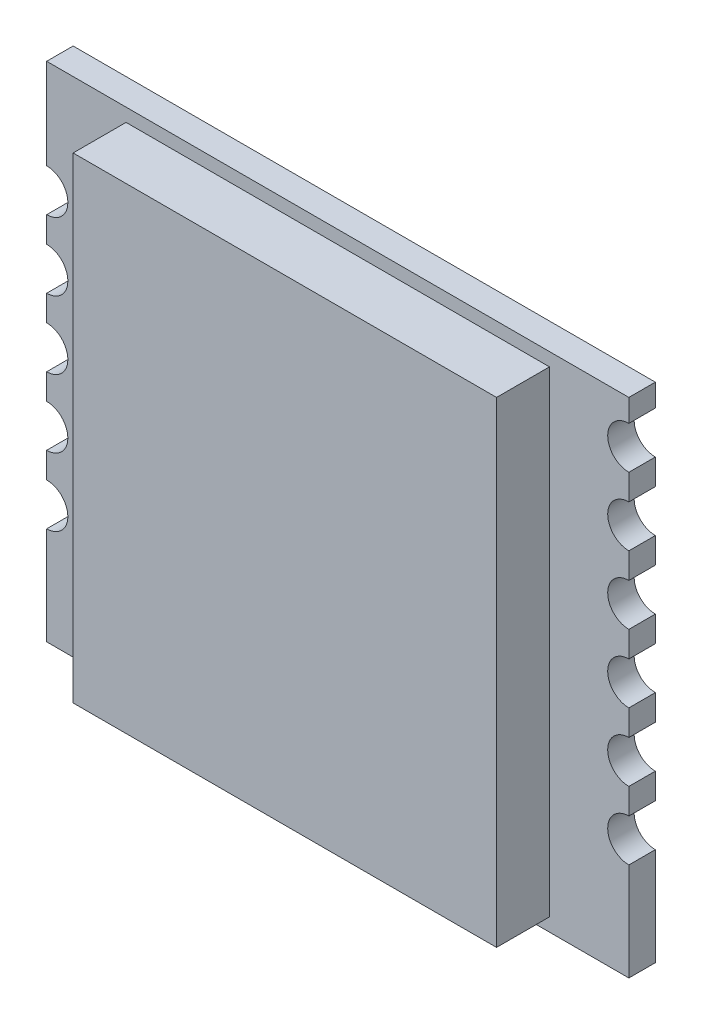
ISO-10303-21;
HEADER;
FILE_DESCRIPTION(('STEP AP214'),'2;1');
FILE_NAME('part.step','',(''),(''),'','','');
FILE_SCHEMA(('AUTOMOTIVE_DESIGN { 1 0 10303 214 1 1 1 1 }'));
ENDSEC;
DATA;
#1=APPLICATION_CONTEXT('core data for automotive mechanical design processes');
#2=APPLICATION_PROTOCOL_DEFINITION('international standard','automotive_design',2000,#1);
#3=PRODUCT_CONTEXT('',#1,'mechanical');
#4=PRODUCT('Part','Part','',(#3));
#5=PRODUCT_RELATED_PRODUCT_CATEGORY('part','',(#4));
#6=PRODUCT_DEFINITION_FORMATION('','',#4);
#7=PRODUCT_DEFINITION_CONTEXT('part definition',#1,'design');
#8=PRODUCT_DEFINITION('design','',#6,#7);
#9=PRODUCT_DEFINITION_SHAPE('','',#8);
#10=(LENGTH_UNIT() NAMED_UNIT(*) SI_UNIT(.MILLI.,.METRE.));
#11=(NAMED_UNIT(*) PLANE_ANGLE_UNIT() SI_UNIT($,.RADIAN.));
#12=(NAMED_UNIT(*) SI_UNIT($,.STERADIAN.) SOLID_ANGLE_UNIT());
#13=UNCERTAINTY_MEASURE_WITH_UNIT(LENGTH_MEASURE(1.E-05),#10,'distance_accuracy_value','');
#14=(GEOMETRIC_REPRESENTATION_CONTEXT(3) GLOBAL_UNCERTAINTY_ASSIGNED_CONTEXT((#13)) GLOBAL_UNIT_ASSIGNED_CONTEXT((#10,
#11,#12)) REPRESENTATION_CONTEXT('',''));
#15=CARTESIAN_POINT('',(0.,0.,0.));
#16=DIRECTION('',(0.,0.,1.));
#17=DIRECTION('',(1.,0.,0.));
#18=AXIS2_PLACEMENT_3D('',#15,#16,#17);
#19=CARTESIAN_POINT('',(0.,0.,3.));
#20=DIRECTION('',(0.,0.,1.));
#21=DIRECTION('',(1.,0.,0.));
#22=AXIS2_PLACEMENT_3D('',#19,#20,#21);
#23=PLANE('',#22);
#24=DIRECTION('',(0.,1.,0.));
#25=VECTOR('',#24,1.);
#26=CARTESIAN_POINT('',(8.,-9.,3.));
#27=LINE('',#26,#25);
#28=CARTESIAN_POINT('',(8.,-9.,3.));
#29=VERTEX_POINT('',#28);
#30=CARTESIAN_POINT('',(8.,9.,3.));
#31=VERTEX_POINT('',#30);
#32=EDGE_CURVE('E226',#29,#31,#27,.T.);
#33=ORIENTED_EDGE('',*,*,#32,.T.);
#34=DIRECTION('',(1.,0.,0.));
#35=VECTOR('',#34,1.);
#36=CARTESIAN_POINT('',(8.,9.,3.));
#37=LINE('',#36,#35);
#38=CARTESIAN_POINT('',(-8.,9.,3.));
#39=VERTEX_POINT('',#38);
#40=EDGE_CURVE('E205',#31,#39,#37,.F.);
#41=ORIENTED_EDGE('',*,*,#40,.T.);
#42=DIRECTION('',(0.,1.,0.));
#43=VECTOR('',#42,1.);
#44=CARTESIAN_POINT('',(-8.,-9.,3.));
#45=LINE('',#44,#43);
#46=CARTESIAN_POINT('',(-8.,-9.,3.));
#47=VERTEX_POINT('',#46);
#48=EDGE_CURVE('E211',#39,#47,#45,.F.);
#49=ORIENTED_EDGE('',*,*,#48,.T.);
#50=DIRECTION('',(-1.,0.,0.));
#51=VECTOR('',#50,1.);
#52=CARTESIAN_POINT('',(8.,-9.,3.));
#53=LINE('',#52,#51);
#54=EDGE_CURVE('E377',#47,#29,#53,.F.);
#55=ORIENTED_EDGE('',*,*,#54,.T.);
#56=EDGE_LOOP('',(#33,#41,#49,#55));
#57=FACE_BOUND('',#56,.T.);
#58=ADVANCED_FACE('F17',(#57),#23,.T.);
#59=CARTESIAN_POINT('',(-8.,-9.,3.));
#60=DIRECTION('',(1.,0.,0.));
#61=DIRECTION('',(0.,0.,-1.));
#62=AXIS2_PLACEMENT_3D('',#59,#60,#61);
#63=PLANE('',#62);
#64=DIRECTION('',(0.,0.,1.));
#65=VECTOR('',#64,1.);
#66=CARTESIAN_POINT('',(-8.,-9.,3.));
#67=LINE('',#66,#65);
#68=CARTESIAN_POINT('',(-8.,-9.,1.));
#69=VERTEX_POINT('',#68);
#70=EDGE_CURVE('E218',#69,#47,#67,.T.);
#71=ORIENTED_EDGE('',*,*,#70,.T.);
#72=ORIENTED_EDGE('',*,*,#48,.F.);
#73=DIRECTION('',(0.,0.,-1.));
#74=VECTOR('',#73,1.);
#75=CARTESIAN_POINT('',(-8.,9.,3.));
#76=LINE('',#75,#74);
#77=CARTESIAN_POINT('',(-8.,9.,1.));
#78=VERTEX_POINT('',#77);
#79=EDGE_CURVE('E215',#39,#78,#76,.T.);
#80=ORIENTED_EDGE('',*,*,#79,.T.);
#81=DIRECTION('',(0.,1.,0.));
#82=VECTOR('',#81,1.);
#83=CARTESIAN_POINT('',(-8.,0.,1.));
#84=LINE('',#83,#82);
#85=EDGE_CURVE('E330',#69,#78,#84,.T.);
#86=ORIENTED_EDGE('',*,*,#85,.F.);
#87=EDGE_LOOP('',(#71,#72,#80,#86));
#88=FACE_BOUND('',#87,.T.);
#89=ADVANCED_FACE('F212',(#88),#63,.F.);
#90=CARTESIAN_POINT('',(8.,9.,3.));
#91=DIRECTION('',(0.,-1.,0.));
#92=DIRECTION('',(0.,0.,-1.));
#93=AXIS2_PLACEMENT_3D('',#90,#91,#92);
#94=PLANE('',#93);
#95=ORIENTED_EDGE('',*,*,#79,.F.);
#96=ORIENTED_EDGE('',*,*,#40,.F.);
#97=DIRECTION('',(0.,0.,1.));
#98=VECTOR('',#97,1.);
#99=CARTESIAN_POINT('',(8.,9.,3.));
#100=LINE('',#99,#98);
#101=CARTESIAN_POINT('',(8.,9.,1.));
#102=VERTEX_POINT('',#101);
#103=EDGE_CURVE('E380',#31,#102,#100,.F.);
#104=ORIENTED_EDGE('',*,*,#103,.T.);
#105=DIRECTION('',(1.,0.,0.));
#106=VECTOR('',#105,1.);
#107=CARTESIAN_POINT('',(0.,9.,1.));
#108=LINE('',#107,#106);
#109=EDGE_CURVE('E225',#78,#102,#108,.T.);
#110=ORIENTED_EDGE('',*,*,#109,.F.);
#111=EDGE_LOOP('',(#95,#96,#104,#110));
#112=FACE_BOUND('',#111,.T.);
#113=ADVANCED_FACE('F223',(#112),#94,.F.);
#114=CARTESIAN_POINT('',(8.,-9.,3.));
#115=DIRECTION('',(-1.,0.,0.));
#116=DIRECTION('',(0.,0.,1.));
#117=AXIS2_PLACEMENT_3D('',#114,#115,#116);
#118=PLANE('',#117);
#119=ORIENTED_EDGE('',*,*,#103,.F.);
#120=ORIENTED_EDGE('',*,*,#32,.F.);
#121=DIRECTION('',(0.,0.,1.));
#122=VECTOR('',#121,1.);
#123=CARTESIAN_POINT('',(8.,-9.,3.));
#124=LINE('',#123,#122);
#125=CARTESIAN_POINT('',(8.,-9.,1.));
#126=VERTEX_POINT('',#125);
#127=EDGE_CURVE('E334',#29,#126,#124,.F.);
#128=ORIENTED_EDGE('',*,*,#127,.T.);
#129=DIRECTION('',(0.,1.,0.));
#130=VECTOR('',#129,1.);
#131=CARTESIAN_POINT('',(8.,0.,1.));
#132=LINE('',#131,#130);
#133=EDGE_CURVE('E317',#102,#126,#132,.F.);
#134=ORIENTED_EDGE('',*,*,#133,.F.);
#135=EDGE_LOOP('',(#119,#120,#128,#134));
#136=FACE_BOUND('',#135,.T.);
#137=ADVANCED_FACE('F385',(#136),#118,.F.);
#138=CARTESIAN_POINT('',(8.,-9.,3.));
#139=DIRECTION('',(0.,1.,0.));
#140=DIRECTION('',(-1.,0.,0.));
#141=AXIS2_PLACEMENT_3D('',#138,#139,#140);
#142=PLANE('',#141);
#143=ORIENTED_EDGE('',*,*,#127,.F.);
#144=ORIENTED_EDGE('',*,*,#54,.F.);
#145=ORIENTED_EDGE('',*,*,#70,.F.);
#146=DIRECTION('',(1.,0.,0.));
#147=VECTOR('',#146,1.);
#148=CARTESIAN_POINT('',(0.,-9.,1.));
#149=LINE('',#148,#147);
#150=EDGE_CURVE('E309',#126,#69,#149,.F.);
#151=ORIENTED_EDGE('',*,*,#150,.F.);
#152=EDGE_LOOP('',(#143,#144,#145,#151));
#153=FACE_BOUND('',#152,.T.);
#154=ADVANCED_FACE('F871',(#153),#142,.F.);
#155=CARTESIAN_POINT('',(0.,0.,1.));
#156=DIRECTION('',(0.,0.,1.));
#157=DIRECTION('',(1.,0.,0.));
#158=AXIS2_PLACEMENT_3D('',#155,#156,#157);
#159=PLANE('',#158);
#160=ORIENTED_EDGE('',*,*,#133,.T.);
#161=ORIENTED_EDGE('',*,*,#150,.T.);
#162=ORIENTED_EDGE('',*,*,#85,.T.);
#163=ORIENTED_EDGE('',*,*,#109,.T.);
#164=EDGE_LOOP('',(#160,#161,#162,#163));
#165=FACE_BOUND('',#164,.T.);
#166=DIRECTION('',(0.,1.,0.));
#167=VECTOR('',#166,1.);
#168=CARTESIAN_POINT('',(-11.,-9.5,1.));
#169=LINE('',#168,#167);
#170=CARTESIAN_POINT('',(-11.,9.5,1.));
#171=VERTEX_POINT('',#170);
#172=CARTESIAN_POINT('',(-11.,6.08,1.));
#173=VERTEX_POINT('',#172);
#174=EDGE_CURVE('E393',#171,#173,#169,.F.);
#175=ORIENTED_EDGE('',*,*,#174,.T.);
#176=CARTESIAN_POINT('',(-11.,5.28,1.));
#177=DIRECTION('',(0.,0.,1.));
#178=DIRECTION('',(1.,0.,0.));
#179=AXIS2_PLACEMENT_3D('',#176,#177,#178);
#180=CIRCLE('',#179,0.8);
#181=CARTESIAN_POINT('',(-11.,4.48,1.));
#182=VERTEX_POINT('',#181);
#183=EDGE_CURVE('E20',#173,#182,#180,.F.);
#184=ORIENTED_EDGE('',*,*,#183,.T.);
#185=DIRECTION('',(0.,1.,0.));
#186=VECTOR('',#185,1.);
#187=CARTESIAN_POINT('',(-11.,0.,1.));
#188=LINE('',#187,#186);
#189=CARTESIAN_POINT('',(-11.,3.51,1.));
#190=VERTEX_POINT('',#189);
#191=EDGE_CURVE('E332',#182,#190,#188,.F.);
#192=ORIENTED_EDGE('',*,*,#191,.T.);
#193=CARTESIAN_POINT('',(-11.,2.71,1.));
#194=DIRECTION('',(0.,0.,1.));
#195=DIRECTION('',(1.,0.,0.));
#196=AXIS2_PLACEMENT_3D('',#193,#194,#195);
#197=CIRCLE('',#196,0.8);
#198=CARTESIAN_POINT('',(-11.,1.91,1.));
#199=VERTEX_POINT('',#198);
#200=EDGE_CURVE('E307',#190,#199,#197,.F.);
#201=ORIENTED_EDGE('',*,*,#200,.T.);
#202=DIRECTION('',(0.,1.,0.));
#203=VECTOR('',#202,1.);
#204=CARTESIAN_POINT('',(-11.,-9.5,1.));
#205=LINE('',#204,#203);
#206=CARTESIAN_POINT('',(-11.,0.94,1.));
#207=VERTEX_POINT('',#206);
#208=EDGE_CURVE('E314',#199,#207,#205,.F.);
#209=ORIENTED_EDGE('',*,*,#208,.T.);
#210=CARTESIAN_POINT('',(-11.,0.14,1.));
#211=DIRECTION('',(0.,0.,1.));
#212=DIRECTION('',(1.,0.,0.));
#213=AXIS2_PLACEMENT_3D('',#210,#211,#212);
#214=CIRCLE('',#213,0.8);
#215=CARTESIAN_POINT('',(-11.,-0.66,1.));
#216=VERTEX_POINT('',#215);
#217=EDGE_CURVE('E304',#207,#216,#214,.F.);
#218=ORIENTED_EDGE('',*,*,#217,.T.);
#219=DIRECTION('',(0.,1.,0.));
#220=VECTOR('',#219,1.);
#221=CARTESIAN_POINT('',(-11.,-9.5,1.));
#222=LINE('',#221,#220);
#223=CARTESIAN_POINT('',(-11.,-1.63,1.));
#224=VERTEX_POINT('',#223);
#225=EDGE_CURVE('E371',#216,#224,#222,.F.);
#226=ORIENTED_EDGE('',*,*,#225,.T.);
#227=CARTESIAN_POINT('',(-11.,-2.43,1.));
#228=DIRECTION('',(0.,0.,1.));
#229=DIRECTION('',(1.,0.,0.));
#230=AXIS2_PLACEMENT_3D('',#227,#228,#229);
#231=CIRCLE('',#230,0.8);
#232=CARTESIAN_POINT('',(-11.,-3.23,1.));
#233=VERTEX_POINT('',#232);
#234=EDGE_CURVE('E300',#224,#233,#231,.F.);
#235=ORIENTED_EDGE('',*,*,#234,.T.);
#236=DIRECTION('',(0.,1.,0.));
#237=VECTOR('',#236,1.);
#238=CARTESIAN_POINT('',(-11.,-9.5,1.));
#239=LINE('',#238,#237);
#240=CARTESIAN_POINT('',(-11.,-4.2,1.));
#241=VERTEX_POINT('',#240);
#242=EDGE_CURVE('E368',#233,#241,#239,.F.);
#243=ORIENTED_EDGE('',*,*,#242,.T.);
#244=CARTESIAN_POINT('',(-11.,-5.,1.));
#245=DIRECTION('',(0.,0.,1.));
#246=DIRECTION('',(1.,0.,0.));
#247=AXIS2_PLACEMENT_3D('',#244,#245,#246);
#248=CIRCLE('',#247,0.8);
#249=CARTESIAN_POINT('',(-11.,-5.8,1.));
#250=VERTEX_POINT('',#249);
#251=EDGE_CURVE('E296',#241,#250,#248,.F.);
#252=ORIENTED_EDGE('',*,*,#251,.T.);
#253=DIRECTION('',(0.,1.,0.));
#254=VECTOR('',#253,1.);
#255=CARTESIAN_POINT('',(-11.,-9.5,1.));
#256=LINE('',#255,#254);
#257=CARTESIAN_POINT('',(-11.,-9.5,1.));
#258=VERTEX_POINT('',#257);
#259=EDGE_CURVE('E364',#250,#258,#256,.F.);
#260=ORIENTED_EDGE('',*,*,#259,.T.);
#261=DIRECTION('',(1.,0.,0.));
#262=VECTOR('',#261,1.);
#263=CARTESIAN_POINT('',(11.,-9.5,1.));
#264=LINE('',#263,#262);
#265=CARTESIAN_POINT('',(11.,-9.5,1.));
#266=VERTEX_POINT('',#265);
#267=EDGE_CURVE('E359',#258,#266,#264,.T.);
#268=ORIENTED_EDGE('',*,*,#267,.T.);
#269=DIRECTION('',(0.,1.,0.));
#270=VECTOR('',#269,1.);
#271=CARTESIAN_POINT('',(11.,-9.5,1.));
#272=LINE('',#271,#270);
#273=CARTESIAN_POINT('',(11.,-5.8,1.));
#274=VERTEX_POINT('',#273);
#275=EDGE_CURVE('E354',#266,#274,#272,.T.);
#276=ORIENTED_EDGE('',*,*,#275,.T.);
#277=CARTESIAN_POINT('',(11.,-5.,1.));
#278=DIRECTION('',(0.,0.,1.));
#279=DIRECTION('',(1.,0.,0.));
#280=AXIS2_PLACEMENT_3D('',#277,#278,#279);
#281=CIRCLE('',#280,0.8);
#282=CARTESIAN_POINT('',(11.,-4.2,1.));
#283=VERTEX_POINT('',#282);
#284=EDGE_CURVE('E292',#274,#283,#281,.F.);
#285=ORIENTED_EDGE('',*,*,#284,.T.);
#286=DIRECTION('',(0.,1.,0.));
#287=VECTOR('',#286,1.);
#288=CARTESIAN_POINT('',(11.,-9.5,1.));
#289=LINE('',#288,#287);
#290=CARTESIAN_POINT('',(11.,-3.23,1.));
#291=VERTEX_POINT('',#290);
#292=EDGE_CURVE('E352',#283,#291,#289,.T.);
#293=ORIENTED_EDGE('',*,*,#292,.T.);
#294=CARTESIAN_POINT('',(11.,-2.43,1.));
#295=DIRECTION('',(0.,0.,1.));
#296=DIRECTION('',(1.,0.,0.));
#297=AXIS2_PLACEMENT_3D('',#294,#295,#296);
#298=CIRCLE('',#297,0.8);
#299=CARTESIAN_POINT('',(11.,-1.63,1.));
#300=VERTEX_POINT('',#299);
#301=EDGE_CURVE('E288',#291,#300,#298,.F.);
#302=ORIENTED_EDGE('',*,*,#301,.T.);
#303=DIRECTION('',(0.,1.,0.));
#304=VECTOR('',#303,1.);
#305=CARTESIAN_POINT('',(11.,-9.5,1.));
#306=LINE('',#305,#304);
#307=CARTESIAN_POINT('',(11.,-0.66,1.));
#308=VERTEX_POINT('',#307);
#309=EDGE_CURVE('E350',#300,#308,#306,.T.);
#310=ORIENTED_EDGE('',*,*,#309,.T.);
#311=CARTESIAN_POINT('',(11.,0.14,1.));
#312=DIRECTION('',(0.,0.,1.));
#313=DIRECTION('',(1.,0.,0.));
#314=AXIS2_PLACEMENT_3D('',#311,#312,#313);
#315=CIRCLE('',#314,0.8);
#316=CARTESIAN_POINT('',(11.,0.94,1.));
#317=VERTEX_POINT('',#316);
#318=EDGE_CURVE('E284',#308,#317,#315,.F.);
#319=ORIENTED_EDGE('',*,*,#318,.T.);
#320=DIRECTION('',(0.,1.,0.));
#321=VECTOR('',#320,1.);
#322=CARTESIAN_POINT('',(11.,-9.5,1.));
#323=LINE('',#322,#321);
#324=CARTESIAN_POINT('',(11.,1.91,1.));
#325=VERTEX_POINT('',#324);
#326=EDGE_CURVE('E348',#317,#325,#323,.T.);
#327=ORIENTED_EDGE('',*,*,#326,.T.);
#328=CARTESIAN_POINT('',(11.,2.71,1.));
#329=DIRECTION('',(0.,0.,1.));
#330=DIRECTION('',(1.,0.,0.));
#331=AXIS2_PLACEMENT_3D('',#328,#329,#330);
#332=CIRCLE('',#331,0.8);
#333=CARTESIAN_POINT('',(11.,3.51,1.));
#334=VERTEX_POINT('',#333);
#335=EDGE_CURVE('E280',#325,#334,#332,.F.);
#336=ORIENTED_EDGE('',*,*,#335,.T.);
#337=DIRECTION('',(0.,1.,0.));
#338=VECTOR('',#337,1.);
#339=CARTESIAN_POINT('',(11.,-9.5,1.));
#340=LINE('',#339,#338);
#341=CARTESIAN_POINT('',(11.,4.48,1.));
#342=VERTEX_POINT('',#341);
#343=EDGE_CURVE('E346',#334,#342,#340,.T.);
#344=ORIENTED_EDGE('',*,*,#343,.T.);
#345=CARTESIAN_POINT('',(11.,5.28,1.));
#346=DIRECTION('',(0.,0.,1.));
#347=DIRECTION('',(1.,0.,0.));
#348=AXIS2_PLACEMENT_3D('',#345,#346,#347);
#349=CIRCLE('',#348,0.8);
#350=CARTESIAN_POINT('',(11.,6.08,1.));
#351=VERTEX_POINT('',#350);
#352=EDGE_CURVE('E276',#342,#351,#349,.F.);
#353=ORIENTED_EDGE('',*,*,#352,.T.);
#354=DIRECTION('',(0.,1.,0.));
#355=VECTOR('',#354,1.);
#356=CARTESIAN_POINT('',(11.,-9.5,1.));
#357=LINE('',#356,#355);
#358=CARTESIAN_POINT('',(11.,7.05,1.));
#359=VERTEX_POINT('',#358);
#360=EDGE_CURVE('E344',#351,#359,#357,.T.);
#361=ORIENTED_EDGE('',*,*,#360,.T.);
#362=CARTESIAN_POINT('',(11.,7.85,1.));
#363=DIRECTION('',(0.,0.,1.));
#364=DIRECTION('',(1.,0.,0.));
#365=AXIS2_PLACEMENT_3D('',#362,#363,#364);
#366=CIRCLE('',#365,0.8);
#367=CARTESIAN_POINT('',(11.,8.65,1.));
#368=VERTEX_POINT('',#367);
#369=EDGE_CURVE('E272',#359,#368,#366,.F.);
#370=ORIENTED_EDGE('',*,*,#369,.T.);
#371=DIRECTION('',(0.,1.,0.));
#372=VECTOR('',#371,1.);
#373=CARTESIAN_POINT('',(11.,-9.5,1.));
#374=LINE('',#373,#372);
#375=CARTESIAN_POINT('',(11.,9.5,1.));
#376=VERTEX_POINT('',#375);
#377=EDGE_CURVE('E340',#368,#376,#374,.T.);
#378=ORIENTED_EDGE('',*,*,#377,.T.);
#379=DIRECTION('',(1.,0.,0.));
#380=VECTOR('',#379,1.);
#381=CARTESIAN_POINT('',(11.,9.5,1.));
#382=LINE('',#381,#380);
#383=EDGE_CURVE('E178',#376,#171,#382,.F.);
#384=ORIENTED_EDGE('',*,*,#383,.T.);
#385=EDGE_LOOP('',(#175,#184,#192,#201,#209,#218,#226,#235,#243,#252,#260,#268,#276,#285,#293,
#302,#310,#319,#327,#336,#344,#353,#361,#370,#378,#384));
#386=FACE_BOUND('',#385,.T.);
#387=ADVANCED_FACE('F387',(#165,#386),#159,.T.);
#388=CARTESIAN_POINT('',(-11.,2.71,0.));
#389=DIRECTION('',(0.,0.,1.));
#390=DIRECTION('',(1.,0.,0.));
#391=AXIS2_PLACEMENT_3D('',#388,#389,#390);
#392=CYLINDRICAL_SURFACE('',#391,0.8);
#393=CARTESIAN_POINT('',(-11.,2.71,0.));
#394=DIRECTION('',(0.,0.,1.));
#395=DIRECTION('',(1.,0.,0.));
#396=AXIS2_PLACEMENT_3D('',#393,#394,#395);
#397=CIRCLE('',#396,0.8);
#398=CARTESIAN_POINT('',(-11.,3.51,0.));
#399=VERTEX_POINT('',#398);
#400=CARTESIAN_POINT('',(-11.,1.91,0.));
#401=VERTEX_POINT('',#400);
#402=EDGE_CURVE('E269',#399,#401,#397,.F.);
#403=ORIENTED_EDGE('',*,*,#402,.T.);
#404=DIRECTION('',(0.,0.,1.));
#405=VECTOR('',#404,1.);
#406=CARTESIAN_POINT('',(-11.,1.91,1.));
#407=LINE('',#406,#405);
#408=EDGE_CURVE('E308',#401,#199,#407,.T.);
#409=ORIENTED_EDGE('',*,*,#408,.T.);
#410=ORIENTED_EDGE('',*,*,#200,.F.);
#411=DIRECTION('',(0.,0.,1.));
#412=VECTOR('',#411,1.);
#413=CARTESIAN_POINT('',(-11.,3.51,1.));
#414=LINE('',#413,#412);
#415=EDGE_CURVE('E398',#190,#399,#414,.F.);
#416=ORIENTED_EDGE('',*,*,#415,.T.);
#417=EDGE_LOOP('',(#403,#409,#410,#416));
#418=FACE_BOUND('',#417,.T.);
#419=ADVANCED_FACE('F853',(#418),#392,.F.);
#420=CARTESIAN_POINT('',(-11.,-9.5,1.));
#421=DIRECTION('',(1.,0.,0.));
#422=DIRECTION('',(0.,1.,0.));
#423=AXIS2_PLACEMENT_3D('',#420,#421,#422);
#424=PLANE('',#423);
#425=ORIENTED_EDGE('',*,*,#408,.F.);
#426=DIRECTION('',(0.,1.,0.));
#427=VECTOR('',#426,1.);
#428=CARTESIAN_POINT('',(-11.,0.,0.));
#429=LINE('',#428,#427);
#430=CARTESIAN_POINT('',(-11.,0.94,0.));
#431=VERTEX_POINT('',#430);
#432=EDGE_CURVE('E268',#401,#431,#429,.F.);
#433=ORIENTED_EDGE('',*,*,#432,.T.);
#434=DIRECTION('',(0.,0.,1.));
#435=VECTOR('',#434,1.);
#436=CARTESIAN_POINT('',(-11.,0.94,0.));
#437=LINE('',#436,#435);
#438=EDGE_CURVE('E306',#431,#207,#437,.T.);
#439=ORIENTED_EDGE('',*,*,#438,.T.);
#440=ORIENTED_EDGE('',*,*,#208,.F.);
#441=EDGE_LOOP('',(#425,#433,#439,#440));
#442=FACE_BOUND('',#441,.T.);
#443=ADVANCED_FACE('F472',(#442),#424,.F.);
#444=CARTESIAN_POINT('',(-11.,0.14,0.));
#445=DIRECTION('',(0.,0.,1.));
#446=DIRECTION('',(1.,0.,0.));
#447=AXIS2_PLACEMENT_3D('',#444,#445,#446);
#448=CYLINDRICAL_SURFACE('',#447,0.8);
#449=CARTESIAN_POINT('',(-11.,0.14,0.));
#450=DIRECTION('',(0.,0.,1.));
#451=DIRECTION('',(1.,0.,0.));
#452=AXIS2_PLACEMENT_3D('',#449,#450,#451);
#453=CIRCLE('',#452,0.8);
#454=CARTESIAN_POINT('',(-11.,-0.66,0.));
#455=VERTEX_POINT('',#454);
#456=EDGE_CURVE('E266',#431,#455,#453,.F.);
#457=ORIENTED_EDGE('',*,*,#456,.T.);
#458=DIRECTION('',(0.,0.,1.));
#459=VECTOR('',#458,1.);
#460=CARTESIAN_POINT('',(-11.,-0.659999999999999,1.));
#461=LINE('',#460,#459);
#462=EDGE_CURVE('E305',#455,#216,#461,.T.);
#463=ORIENTED_EDGE('',*,*,#462,.T.);
#464=ORIENTED_EDGE('',*,*,#217,.F.);
#465=ORIENTED_EDGE('',*,*,#438,.F.);
#466=EDGE_LOOP('',(#457,#463,#464,#465));
#467=FACE_BOUND('',#466,.T.);
#468=ADVANCED_FACE('F476',(#467),#448,.F.);
#469=CARTESIAN_POINT('',(-11.,-9.5,1.));
#470=DIRECTION('',(1.,0.,0.));
#471=DIRECTION('',(0.,1.,0.));
#472=AXIS2_PLACEMENT_3D('',#469,#470,#471);
#473=PLANE('',#472);
#474=ORIENTED_EDGE('',*,*,#462,.F.);
#475=DIRECTION('',(0.,1.,0.));
#476=VECTOR('',#475,1.);
#477=CARTESIAN_POINT('',(-11.,0.,0.));
#478=LINE('',#477,#476);
#479=CARTESIAN_POINT('',(-11.,-1.63,0.));
#480=VERTEX_POINT('',#479);
#481=EDGE_CURVE('E265',#455,#480,#478,.F.);
#482=ORIENTED_EDGE('',*,*,#481,.T.);
#483=DIRECTION('',(0.,0.,1.));
#484=VECTOR('',#483,1.);
#485=CARTESIAN_POINT('',(-11.,-1.63,0.));
#486=LINE('',#485,#484);
#487=EDGE_CURVE('E303',#480,#224,#486,.T.);
#488=ORIENTED_EDGE('',*,*,#487,.T.);
#489=ORIENTED_EDGE('',*,*,#225,.F.);
#490=EDGE_LOOP('',(#474,#482,#488,#489));
#491=FACE_BOUND('',#490,.T.);
#492=ADVANCED_FACE('F591',(#491),#473,.F.);
#493=CARTESIAN_POINT('',(-11.,-2.43,0.));
#494=DIRECTION('',(0.,0.,1.));
#495=DIRECTION('',(1.,0.,0.));
#496=AXIS2_PLACEMENT_3D('',#493,#494,#495);
#497=CYLINDRICAL_SURFACE('',#496,0.8);
#498=CARTESIAN_POINT('',(-11.,-2.43,0.));
#499=DIRECTION('',(0.,0.,1.));
#500=DIRECTION('',(1.,0.,0.));
#501=AXIS2_PLACEMENT_3D('',#498,#499,#500);
#502=CIRCLE('',#501,0.8);
#503=CARTESIAN_POINT('',(-11.,-3.23,0.));
#504=VERTEX_POINT('',#503);
#505=EDGE_CURVE('E263',#480,#504,#502,.F.);
#506=ORIENTED_EDGE('',*,*,#505,.T.);
#507=DIRECTION('',(0.,0.,1.));
#508=VECTOR('',#507,1.);
#509=CARTESIAN_POINT('',(-11.,-3.23,1.));
#510=LINE('',#509,#508);
#511=EDGE_CURVE('E302',#504,#233,#510,.T.);
#512=ORIENTED_EDGE('',*,*,#511,.T.);
#513=ORIENTED_EDGE('',*,*,#234,.F.);
#514=ORIENTED_EDGE('',*,*,#487,.F.);
#515=EDGE_LOOP('',(#506,#512,#513,#514));
#516=FACE_BOUND('',#515,.T.);
#517=ADVANCED_FACE('F589',(#516),#497,.F.);
#518=CARTESIAN_POINT('',(-11.,-9.5,1.));
#519=DIRECTION('',(1.,0.,0.));
#520=DIRECTION('',(0.,1.,0.));
#521=AXIS2_PLACEMENT_3D('',#518,#519,#520);
#522=PLANE('',#521);
#523=ORIENTED_EDGE('',*,*,#511,.F.);
#524=DIRECTION('',(0.,1.,0.));
#525=VECTOR('',#524,1.);
#526=CARTESIAN_POINT('',(-11.,0.,0.));
#527=LINE('',#526,#525);
#528=CARTESIAN_POINT('',(-11.,-4.2,0.));
#529=VERTEX_POINT('',#528);
#530=EDGE_CURVE('E262',#504,#529,#527,.F.);
#531=ORIENTED_EDGE('',*,*,#530,.T.);
#532=DIRECTION('',(0.,0.,1.));
#533=VECTOR('',#532,1.);
#534=CARTESIAN_POINT('',(-11.,-4.2,0.));
#535=LINE('',#534,#533);
#536=EDGE_CURVE('E299',#529,#241,#535,.T.);
#537=ORIENTED_EDGE('',*,*,#536,.T.);
#538=ORIENTED_EDGE('',*,*,#242,.F.);
#539=EDGE_LOOP('',(#523,#531,#537,#538));
#540=FACE_BOUND('',#539,.T.);
#541=ADVANCED_FACE('F586',(#540),#522,.F.);
#542=CARTESIAN_POINT('',(-11.,-5.,0.));
#543=DIRECTION('',(0.,0.,1.));
#544=DIRECTION('',(1.,0.,0.));
#545=AXIS2_PLACEMENT_3D('',#542,#543,#544);
#546=CYLINDRICAL_SURFACE('',#545,0.8);
#547=CARTESIAN_POINT('',(-11.,-5.,0.));
#548=DIRECTION('',(0.,0.,1.));
#549=DIRECTION('',(1.,0.,0.));
#550=AXIS2_PLACEMENT_3D('',#547,#548,#549);
#551=CIRCLE('',#550,0.8);
#552=CARTESIAN_POINT('',(-11.,-5.8,0.));
#553=VERTEX_POINT('',#552);
#554=EDGE_CURVE('E259',#529,#553,#551,.F.);
#555=ORIENTED_EDGE('',*,*,#554,.T.);
#556=DIRECTION('',(0.,0.,1.));
#557=VECTOR('',#556,1.);
#558=CARTESIAN_POINT('',(-11.,-5.8,1.));
#559=LINE('',#558,#557);
#560=EDGE_CURVE('E298',#553,#250,#559,.T.);
#561=ORIENTED_EDGE('',*,*,#560,.T.);
#562=ORIENTED_EDGE('',*,*,#251,.F.);
#563=ORIENTED_EDGE('',*,*,#536,.F.);
#564=EDGE_LOOP('',(#555,#561,#562,#563));
#565=FACE_BOUND('',#564,.T.);
#566=ADVANCED_FACE('F592',(#565),#546,.F.);
#567=CARTESIAN_POINT('',(-11.,-9.5,1.));
#568=DIRECTION('',(1.,0.,0.));
#569=DIRECTION('',(0.,1.,0.));
#570=AXIS2_PLACEMENT_3D('',#567,#568,#569);
#571=PLANE('',#570);
#572=ORIENTED_EDGE('',*,*,#560,.F.);
#573=DIRECTION('',(0.,1.,0.));
#574=VECTOR('',#573,1.);
#575=CARTESIAN_POINT('',(-11.,0.,0.));
#576=LINE('',#575,#574);
#577=CARTESIAN_POINT('',(-11.,-9.5,0.));
#578=VERTEX_POINT('',#577);
#579=EDGE_CURVE('E261',#553,#578,#576,.F.);
#580=ORIENTED_EDGE('',*,*,#579,.T.);
#581=DIRECTION('',(0.,0.,1.));
#582=VECTOR('',#581,1.);
#583=CARTESIAN_POINT('',(-11.,-9.5,1.));
#584=LINE('',#583,#582);
#585=EDGE_CURVE('E361',#578,#258,#584,.T.);
#586=ORIENTED_EDGE('',*,*,#585,.T.);
#587=ORIENTED_EDGE('',*,*,#259,.F.);
#588=EDGE_LOOP('',(#572,#580,#586,#587));
#589=FACE_BOUND('',#588,.T.);
#590=ADVANCED_FACE('F581',(#589),#571,.F.);
#591=CARTESIAN_POINT('',(11.,-9.5,1.));
#592=DIRECTION('',(0.,1.,0.));
#593=DIRECTION('',(0.,0.,1.));
#594=AXIS2_PLACEMENT_3D('',#591,#592,#593);
#595=PLANE('',#594);
#596=DIRECTION('',(0.,0.,1.));
#597=VECTOR('',#596,1.);
#598=CARTESIAN_POINT('',(11.,-9.5,1.));
#599=LINE('',#598,#597);
#600=CARTESIAN_POINT('',(11.,-9.5,0.));
#601=VERTEX_POINT('',#600);
#602=EDGE_CURVE('E356',#601,#266,#599,.T.);
#603=ORIENTED_EDGE('',*,*,#602,.T.);
#604=ORIENTED_EDGE('',*,*,#267,.F.);
#605=ORIENTED_EDGE('',*,*,#585,.F.);
#606=DIRECTION('',(1.,0.,0.));
#607=VECTOR('',#606,1.);
#608=CARTESIAN_POINT('',(0.,-9.5,0.));
#609=LINE('',#608,#607);
#610=EDGE_CURVE('E449',#578,#601,#609,.T.);
#611=ORIENTED_EDGE('',*,*,#610,.T.);
#612=EDGE_LOOP('',(#603,#604,#605,#611));
#613=FACE_BOUND('',#612,.T.);
#614=ADVANCED_FACE('F576',(#613),#595,.F.);
#615=CARTESIAN_POINT('',(11.,-9.5,1.));
#616=DIRECTION('',(-1.,0.,0.));
#617=DIRECTION('',(0.,0.,1.));
#618=AXIS2_PLACEMENT_3D('',#615,#616,#617);
#619=PLANE('',#618);
#620=DIRECTION('',(0.,0.,1.));
#621=VECTOR('',#620,1.);
#622=CARTESIAN_POINT('',(11.,-5.8,0.));
#623=LINE('',#622,#621);
#624=CARTESIAN_POINT('',(11.,-5.8,0.));
#625=VERTEX_POINT('',#624);
#626=EDGE_CURVE('E295',#625,#274,#623,.T.);
#627=ORIENTED_EDGE('',*,*,#626,.T.);
#628=ORIENTED_EDGE('',*,*,#275,.F.);
#629=ORIENTED_EDGE('',*,*,#602,.F.);
#630=DIRECTION('',(0.,1.,0.));
#631=VECTOR('',#630,1.);
#632=CARTESIAN_POINT('',(11.,0.,0.));
#633=LINE('',#632,#631);
#634=EDGE_CURVE('E258',#601,#625,#633,.T.);
#635=ORIENTED_EDGE('',*,*,#634,.T.);
#636=EDGE_LOOP('',(#627,#628,#629,#635));
#637=FACE_BOUND('',#636,.T.);
#638=ADVANCED_FACE('F572',(#637),#619,.F.);
#639=CARTESIAN_POINT('',(11.,-5.,0.));
#640=DIRECTION('',(0.,0.,1.));
#641=DIRECTION('',(1.,0.,0.));
#642=AXIS2_PLACEMENT_3D('',#639,#640,#641);
#643=CYLINDRICAL_SURFACE('',#642,0.8);
#644=ORIENTED_EDGE('',*,*,#626,.F.);
#645=CARTESIAN_POINT('',(11.,-5.,0.));
#646=DIRECTION('',(0.,0.,1.));
#647=DIRECTION('',(1.,0.,0.));
#648=AXIS2_PLACEMENT_3D('',#645,#646,#647);
#649=CIRCLE('',#648,0.8);
#650=CARTESIAN_POINT('',(11.,-4.2,0.));
#651=VERTEX_POINT('',#650);
#652=EDGE_CURVE('E255',#625,#651,#649,.F.);
#653=ORIENTED_EDGE('',*,*,#652,.T.);
#654=DIRECTION('',(0.,0.,1.));
#655=VECTOR('',#654,1.);
#656=CARTESIAN_POINT('',(11.,-4.2,1.));
#657=LINE('',#656,#655);
#658=EDGE_CURVE('E294',#651,#283,#657,.T.);
#659=ORIENTED_EDGE('',*,*,#658,.T.);
#660=ORIENTED_EDGE('',*,*,#284,.F.);
#661=EDGE_LOOP('',(#644,#653,#659,#660));
#662=FACE_BOUND('',#661,.T.);
#663=ADVANCED_FACE('F568',(#662),#643,.F.);
#664=CARTESIAN_POINT('',(11.,-9.5,1.));
#665=DIRECTION('',(-1.,0.,0.));
#666=DIRECTION('',(0.,0.,1.));
#667=AXIS2_PLACEMENT_3D('',#664,#665,#666);
#668=PLANE('',#667);
#669=DIRECTION('',(0.,0.,1.));
#670=VECTOR('',#669,1.);
#671=CARTESIAN_POINT('',(11.,-3.23,0.));
#672=LINE('',#671,#670);
#673=CARTESIAN_POINT('',(11.,-3.23,0.));
#674=VERTEX_POINT('',#673);
#675=EDGE_CURVE('E291',#674,#291,#672,.T.);
#676=ORIENTED_EDGE('',*,*,#675,.T.);
#677=ORIENTED_EDGE('',*,*,#292,.F.);
#678=ORIENTED_EDGE('',*,*,#658,.F.);
#679=DIRECTION('',(0.,1.,0.));
#680=VECTOR('',#679,1.);
#681=CARTESIAN_POINT('',(11.,0.,0.));
#682=LINE('',#681,#680);
#683=EDGE_CURVE('E254',#651,#674,#682,.T.);
#684=ORIENTED_EDGE('',*,*,#683,.T.);
#685=EDGE_LOOP('',(#676,#677,#678,#684));
#686=FACE_BOUND('',#685,.T.);
#687=ADVANCED_FACE('F564',(#686),#668,.F.);
#688=CARTESIAN_POINT('',(11.,-2.43,0.));
#689=DIRECTION('',(0.,0.,1.));
#690=DIRECTION('',(1.,0.,0.));
#691=AXIS2_PLACEMENT_3D('',#688,#689,#690);
#692=CYLINDRICAL_SURFACE('',#691,0.8);
#693=ORIENTED_EDGE('',*,*,#675,.F.);
#694=CARTESIAN_POINT('',(11.,-2.43,0.));
#695=DIRECTION('',(0.,0.,1.));
#696=DIRECTION('',(1.,0.,0.));
#697=AXIS2_PLACEMENT_3D('',#694,#695,#696);
#698=CIRCLE('',#697,0.8);
#699=CARTESIAN_POINT('',(11.,-1.63,0.));
#700=VERTEX_POINT('',#699);
#701=EDGE_CURVE('E251',#674,#700,#698,.F.);
#702=ORIENTED_EDGE('',*,*,#701,.T.);
#703=DIRECTION('',(0.,0.,1.));
#704=VECTOR('',#703,1.);
#705=CARTESIAN_POINT('',(11.,-1.63,1.));
#706=LINE('',#705,#704);
#707=EDGE_CURVE('E290',#700,#300,#706,.T.);
#708=ORIENTED_EDGE('',*,*,#707,.T.);
#709=ORIENTED_EDGE('',*,*,#301,.F.);
#710=EDGE_LOOP('',(#693,#702,#708,#709));
#711=FACE_BOUND('',#710,.T.);
#712=ADVANCED_FACE('F560',(#711),#692,.F.);
#713=CARTESIAN_POINT('',(11.,-9.5,1.));
#714=DIRECTION('',(-1.,0.,0.));
#715=DIRECTION('',(0.,0.,1.));
#716=AXIS2_PLACEMENT_3D('',#713,#714,#715);
#717=PLANE('',#716);
#718=ORIENTED_EDGE('',*,*,#707,.F.);
#719=DIRECTION('',(0.,1.,0.));
#720=VECTOR('',#719,1.);
#721=CARTESIAN_POINT('',(11.,0.,0.));
#722=LINE('',#721,#720);
#723=CARTESIAN_POINT('',(11.,-0.66,0.));
#724=VERTEX_POINT('',#723);
#725=EDGE_CURVE('E250',#700,#724,#722,.T.);
#726=ORIENTED_EDGE('',*,*,#725,.T.);
#727=DIRECTION('',(0.,0.,1.));
#728=VECTOR('',#727,1.);
#729=CARTESIAN_POINT('',(11.,-0.66,0.));
#730=LINE('',#729,#728);
#731=EDGE_CURVE('E287',#724,#308,#730,.T.);
#732=ORIENTED_EDGE('',*,*,#731,.T.);
#733=ORIENTED_EDGE('',*,*,#309,.F.);
#734=EDGE_LOOP('',(#718,#726,#732,#733));
#735=FACE_BOUND('',#734,.T.);
#736=ADVANCED_FACE('F556',(#735),#717,.F.);
#737=CARTESIAN_POINT('',(11.,0.14,0.));
#738=DIRECTION('',(0.,0.,1.));
#739=DIRECTION('',(1.,0.,0.));
#740=AXIS2_PLACEMENT_3D('',#737,#738,#739);
#741=CYLINDRICAL_SURFACE('',#740,0.8);
#742=ORIENTED_EDGE('',*,*,#731,.F.);
#743=CARTESIAN_POINT('',(11.,0.14,0.));
#744=DIRECTION('',(0.,0.,1.));
#745=DIRECTION('',(1.,0.,0.));
#746=AXIS2_PLACEMENT_3D('',#743,#744,#745);
#747=CIRCLE('',#746,0.8);
#748=CARTESIAN_POINT('',(11.,0.94,0.));
#749=VERTEX_POINT('',#748);
#750=EDGE_CURVE('E247',#724,#749,#747,.F.);
#751=ORIENTED_EDGE('',*,*,#750,.T.);
#752=DIRECTION('',(0.,0.,1.));
#753=VECTOR('',#752,1.);
#754=CARTESIAN_POINT('',(11.,0.94,1.));
#755=LINE('',#754,#753);
#756=EDGE_CURVE('E286',#749,#317,#755,.T.);
#757=ORIENTED_EDGE('',*,*,#756,.T.);
#758=ORIENTED_EDGE('',*,*,#318,.F.);
#759=EDGE_LOOP('',(#742,#751,#757,#758));
#760=FACE_BOUND('',#759,.T.);
#761=ADVANCED_FACE('F552',(#760),#741,.F.);
#762=CARTESIAN_POINT('',(11.,-9.5,1.));
#763=DIRECTION('',(-1.,0.,0.));
#764=DIRECTION('',(0.,0.,1.));
#765=AXIS2_PLACEMENT_3D('',#762,#763,#764);
#766=PLANE('',#765);
#767=ORIENTED_EDGE('',*,*,#756,.F.);
#768=DIRECTION('',(0.,1.,0.));
#769=VECTOR('',#768,1.);
#770=CARTESIAN_POINT('',(11.,0.,0.));
#771=LINE('',#770,#769);
#772=CARTESIAN_POINT('',(11.,1.91,0.));
#773=VERTEX_POINT('',#772);
#774=EDGE_CURVE('E246',#749,#773,#771,.T.);
#775=ORIENTED_EDGE('',*,*,#774,.T.);
#776=DIRECTION('',(0.,0.,1.));
#777=VECTOR('',#776,1.);
#778=CARTESIAN_POINT('',(11.,1.91,0.));
#779=LINE('',#778,#777);
#780=EDGE_CURVE('E283',#773,#325,#779,.T.);
#781=ORIENTED_EDGE('',*,*,#780,.T.);
#782=ORIENTED_EDGE('',*,*,#326,.F.);
#783=EDGE_LOOP('',(#767,#775,#781,#782));
#784=FACE_BOUND('',#783,.T.);
#785=ADVANCED_FACE('F548',(#784),#766,.F.);
#786=CARTESIAN_POINT('',(11.,2.71,0.));
#787=DIRECTION('',(0.,0.,1.));
#788=DIRECTION('',(1.,0.,0.));
#789=AXIS2_PLACEMENT_3D('',#786,#787,#788);
#790=CYLINDRICAL_SURFACE('',#789,0.8);
#791=ORIENTED_EDGE('',*,*,#780,.F.);
#792=CARTESIAN_POINT('',(11.,2.71,0.));
#793=DIRECTION('',(0.,0.,1.));
#794=DIRECTION('',(1.,0.,0.));
#795=AXIS2_PLACEMENT_3D('',#792,#793,#794);
#796=CIRCLE('',#795,0.8);
#797=CARTESIAN_POINT('',(11.,3.51,0.));
#798=VERTEX_POINT('',#797);
#799=EDGE_CURVE('E243',#773,#798,#796,.F.);
#800=ORIENTED_EDGE('',*,*,#799,.T.);
#801=DIRECTION('',(0.,0.,1.));
#802=VECTOR('',#801,1.);
#803=CARTESIAN_POINT('',(11.,3.51,1.));
#804=LINE('',#803,#802);
#805=EDGE_CURVE('E282',#798,#334,#804,.T.);
#806=ORIENTED_EDGE('',*,*,#805,.T.);
#807=ORIENTED_EDGE('',*,*,#335,.F.);
#808=EDGE_LOOP('',(#791,#800,#806,#807));
#809=FACE_BOUND('',#808,.T.);
#810=ADVANCED_FACE('F544',(#809),#790,.F.);
#811=CARTESIAN_POINT('',(11.,-9.5,1.));
#812=DIRECTION('',(-1.,0.,0.));
#813=DIRECTION('',(0.,0.,1.));
#814=AXIS2_PLACEMENT_3D('',#811,#812,#813);
#815=PLANE('',#814);
#816=ORIENTED_EDGE('',*,*,#805,.F.);
#817=DIRECTION('',(0.,1.,0.));
#818=VECTOR('',#817,1.);
#819=CARTESIAN_POINT('',(11.,0.,0.));
#820=LINE('',#819,#818);
#821=CARTESIAN_POINT('',(11.,4.48,0.));
#822=VERTEX_POINT('',#821);
#823=EDGE_CURVE('E242',#798,#822,#820,.T.);
#824=ORIENTED_EDGE('',*,*,#823,.T.);
#825=DIRECTION('',(0.,0.,1.));
#826=VECTOR('',#825,1.);
#827=CARTESIAN_POINT('',(11.,4.48,0.));
#828=LINE('',#827,#826);
#829=EDGE_CURVE('E279',#822,#342,#828,.T.);
#830=ORIENTED_EDGE('',*,*,#829,.T.);
#831=ORIENTED_EDGE('',*,*,#343,.F.);
#832=EDGE_LOOP('',(#816,#824,#830,#831));
#833=FACE_BOUND('',#832,.T.);
#834=ADVANCED_FACE('F540',(#833),#815,.F.);
#835=CARTESIAN_POINT('',(11.,5.28,0.));
#836=DIRECTION('',(0.,0.,1.));
#837=DIRECTION('',(1.,0.,0.));
#838=AXIS2_PLACEMENT_3D('',#835,#836,#837);
#839=CYLINDRICAL_SURFACE('',#838,0.8);
#840=ORIENTED_EDGE('',*,*,#829,.F.);
#841=CARTESIAN_POINT('',(11.,5.28,0.));
#842=DIRECTION('',(0.,0.,1.));
#843=DIRECTION('',(1.,0.,0.));
#844=AXIS2_PLACEMENT_3D('',#841,#842,#843);
#845=CIRCLE('',#844,0.8);
#846=CARTESIAN_POINT('',(11.,6.08,0.));
#847=VERTEX_POINT('',#846);
#848=EDGE_CURVE('E239',#822,#847,#845,.F.);
#849=ORIENTED_EDGE('',*,*,#848,.T.);
#850=DIRECTION('',(0.,0.,1.));
#851=VECTOR('',#850,1.);
#852=CARTESIAN_POINT('',(11.,6.08,1.));
#853=LINE('',#852,#851);
#854=EDGE_CURVE('E278',#847,#351,#853,.T.);
#855=ORIENTED_EDGE('',*,*,#854,.T.);
#856=ORIENTED_EDGE('',*,*,#352,.F.);
#857=EDGE_LOOP('',(#840,#849,#855,#856));
#858=FACE_BOUND('',#857,.T.);
#859=ADVANCED_FACE('F536',(#858),#839,.F.);
#860=CARTESIAN_POINT('',(11.,-9.5,1.));
#861=DIRECTION('',(-1.,0.,0.));
#862=DIRECTION('',(0.,0.,1.));
#863=AXIS2_PLACEMENT_3D('',#860,#861,#862);
#864=PLANE('',#863);
#865=ORIENTED_EDGE('',*,*,#854,.F.);
#866=DIRECTION('',(0.,1.,0.));
#867=VECTOR('',#866,1.);
#868=CARTESIAN_POINT('',(11.,0.,0.));
#869=LINE('',#868,#867);
#870=CARTESIAN_POINT('',(11.,7.05,0.));
#871=VERTEX_POINT('',#870);
#872=EDGE_CURVE('E238',#847,#871,#869,.T.);
#873=ORIENTED_EDGE('',*,*,#872,.T.);
#874=DIRECTION('',(0.,0.,1.));
#875=VECTOR('',#874,1.);
#876=CARTESIAN_POINT('',(11.,7.05,0.));
#877=LINE('',#876,#875);
#878=EDGE_CURVE('E275',#871,#359,#877,.T.);
#879=ORIENTED_EDGE('',*,*,#878,.T.);
#880=ORIENTED_EDGE('',*,*,#360,.F.);
#881=EDGE_LOOP('',(#865,#873,#879,#880));
#882=FACE_BOUND('',#881,.T.);
#883=ADVANCED_FACE('F532',(#882),#864,.F.);
#884=CARTESIAN_POINT('',(11.,7.85,0.));
#885=DIRECTION('',(0.,0.,1.));
#886=DIRECTION('',(1.,0.,0.));
#887=AXIS2_PLACEMENT_3D('',#884,#885,#886);
#888=CYLINDRICAL_SURFACE('',#887,0.8);
#889=ORIENTED_EDGE('',*,*,#878,.F.);
#890=CARTESIAN_POINT('',(11.,7.85,0.));
#891=DIRECTION('',(0.,0.,1.));
#892=DIRECTION('',(1.,0.,0.));
#893=AXIS2_PLACEMENT_3D('',#890,#891,#892);
#894=CIRCLE('',#893,0.8);
#895=CARTESIAN_POINT('',(11.,8.65,0.));
#896=VERTEX_POINT('',#895);
#897=EDGE_CURVE('E234',#871,#896,#894,.F.);
#898=ORIENTED_EDGE('',*,*,#897,.T.);
#899=DIRECTION('',(0.,0.,1.));
#900=VECTOR('',#899,1.);
#901=CARTESIAN_POINT('',(11.,8.65,1.));
#902=LINE('',#901,#900);
#903=EDGE_CURVE('E274',#896,#368,#902,.T.);
#904=ORIENTED_EDGE('',*,*,#903,.T.);
#905=ORIENTED_EDGE('',*,*,#369,.F.);
#906=EDGE_LOOP('',(#889,#898,#904,#905));
#907=FACE_BOUND('',#906,.T.);
#908=ADVANCED_FACE('F528',(#907),#888,.F.);
#909=CARTESIAN_POINT('',(11.,-9.5,1.));
#910=DIRECTION('',(-1.,0.,0.));
#911=DIRECTION('',(0.,0.,1.));
#912=AXIS2_PLACEMENT_3D('',#909,#910,#911);
#913=PLANE('',#912);
#914=ORIENTED_EDGE('',*,*,#903,.F.);
#915=DIRECTION('',(0.,1.,0.));
#916=VECTOR('',#915,1.);
#917=CARTESIAN_POINT('',(11.,0.,0.));
#918=LINE('',#917,#916);
#919=CARTESIAN_POINT('',(11.,9.5,0.));
#920=VERTEX_POINT('',#919);
#921=EDGE_CURVE('E237',#896,#920,#918,.T.);
#922=ORIENTED_EDGE('',*,*,#921,.T.);
#923=DIRECTION('',(0.,0.,1.));
#924=VECTOR('',#923,1.);
#925=CARTESIAN_POINT('',(11.,9.5,1.));
#926=LINE('',#925,#924);
#927=EDGE_CURVE('E337',#920,#376,#926,.T.);
#928=ORIENTED_EDGE('',*,*,#927,.T.);
#929=ORIENTED_EDGE('',*,*,#377,.F.);
#930=EDGE_LOOP('',(#914,#922,#928,#929));
#931=FACE_BOUND('',#930,.T.);
#932=ADVANCED_FACE('F524',(#931),#913,.F.);
#933=CARTESIAN_POINT('',(11.,9.5,1.));
#934=DIRECTION('',(0.,-1.,0.));
#935=DIRECTION('',(1.,0.,0.));
#936=AXIS2_PLACEMENT_3D('',#933,#934,#935);
#937=PLANE('',#936);
#938=DIRECTION('',(0.,0.,1.));
#939=VECTOR('',#938,1.);
#940=CARTESIAN_POINT('',(-11.,9.5,1.));
#941=LINE('',#940,#939);
#942=CARTESIAN_POINT('',(-11.,9.5,0.));
#943=VERTEX_POINT('',#942);
#944=EDGE_CURVE('E336',#943,#171,#941,.T.);
#945=ORIENTED_EDGE('',*,*,#944,.T.);
#946=ORIENTED_EDGE('',*,*,#383,.F.);
#947=ORIENTED_EDGE('',*,*,#927,.F.);
#948=DIRECTION('',(1.,0.,0.));
#949=VECTOR('',#948,1.);
#950=CARTESIAN_POINT('',(0.,9.5,0.));
#951=LINE('',#950,#949);
#952=EDGE_CURVE('E412',#920,#943,#951,.F.);
#953=ORIENTED_EDGE('',*,*,#952,.T.);
#954=EDGE_LOOP('',(#945,#946,#947,#953));
#955=FACE_BOUND('',#954,.T.);
#956=ADVANCED_FACE('F521',(#955),#937,.F.);
#957=CARTESIAN_POINT('',(-11.,-9.5,1.));
#958=DIRECTION('',(1.,0.,0.));
#959=DIRECTION('',(0.,1.,0.));
#960=AXIS2_PLACEMENT_3D('',#957,#958,#959);
#961=PLANE('',#960);
#962=DIRECTION('',(0.,0.,1.));
#963=VECTOR('',#962,1.);
#964=CARTESIAN_POINT('',(-11.,6.08,0.));
#965=LINE('',#964,#963);
#966=CARTESIAN_POINT('',(-11.,6.08,0.));
#967=VERTEX_POINT('',#966);
#968=EDGE_CURVE('E403',#967,#173,#965,.T.);
#969=ORIENTED_EDGE('',*,*,#968,.T.);
#970=ORIENTED_EDGE('',*,*,#174,.F.);
#971=ORIENTED_EDGE('',*,*,#944,.F.);
#972=DIRECTION('',(0.,1.,0.));
#973=VECTOR('',#972,1.);
#974=CARTESIAN_POINT('',(-11.,0.,0.));
#975=LINE('',#974,#973);
#976=EDGE_CURVE('E233',#943,#967,#975,.F.);
#977=ORIENTED_EDGE('',*,*,#976,.T.);
#978=EDGE_LOOP('',(#969,#970,#971,#977));
#979=FACE_BOUND('',#978,.T.);
#980=ADVANCED_FACE('F517',(#979),#961,.F.);
#981=CARTESIAN_POINT('',(-11.,5.28,0.));
#982=DIRECTION('',(0.,0.,1.));
#983=DIRECTION('',(1.,0.,0.));
#984=AXIS2_PLACEMENT_3D('',#981,#982,#983);
#985=CYLINDRICAL_SURFACE('',#984,0.8);
#986=CARTESIAN_POINT('',(-11.,5.28,0.));
#987=DIRECTION('',(0.,0.,1.));
#988=DIRECTION('',(1.,0.,0.));
#989=AXIS2_PLACEMENT_3D('',#986,#987,#988);
#990=CIRCLE('',#989,0.8);
#991=CARTESIAN_POINT('',(-11.,4.48,0.));
#992=VERTEX_POINT('',#991);
#993=EDGE_CURVE('E26',#967,#992,#990,.F.);
#994=ORIENTED_EDGE('',*,*,#993,.T.);
#995=DIRECTION('',(0.,0.,1.));
#996=VECTOR('',#995,1.);
#997=CARTESIAN_POINT('',(-11.,4.48,1.));
#998=LINE('',#997,#996);
#999=EDGE_CURVE('E271',#992,#182,#998,.T.);
#1000=ORIENTED_EDGE('',*,*,#999,.T.);
#1001=ORIENTED_EDGE('',*,*,#183,.F.);
#1002=ORIENTED_EDGE('',*,*,#968,.F.);
#1003=EDGE_LOOP('',(#994,#1000,#1001,#1002));
#1004=FACE_BOUND('',#1003,.T.);
#1005=ADVANCED_FACE('F395',(#1004),#985,.F.);
#1006=CARTESIAN_POINT('',(-11.,-9.5,1.));
#1007=DIRECTION('',(1.,0.,0.));
#1008=DIRECTION('',(0.,1.,0.));
#1009=AXIS2_PLACEMENT_3D('',#1006,#1007,#1008);
#1010=PLANE('',#1009);
#1011=ORIENTED_EDGE('',*,*,#999,.F.);
#1012=DIRECTION('',(0.,1.,0.));
#1013=VECTOR('',#1012,1.);
#1014=CARTESIAN_POINT('',(-11.,0.,0.));
#1015=LINE('',#1014,#1013);
#1016=EDGE_CURVE('E11',#992,#399,#1015,.F.);
#1017=ORIENTED_EDGE('',*,*,#1016,.T.);
#1018=ORIENTED_EDGE('',*,*,#415,.F.);
#1019=ORIENTED_EDGE('',*,*,#191,.F.);
#1020=EDGE_LOOP('',(#1011,#1017,#1018,#1019));
#1021=FACE_BOUND('',#1020,.T.);
#1022=ADVANCED_FACE('F400',(#1021),#1010,.F.);
#1023=CARTESIAN_POINT('',(0.,0.,0.));
#1024=DIRECTION('',(0.,0.,1.));
#1025=DIRECTION('',(1.,0.,0.));
#1026=AXIS2_PLACEMENT_3D('',#1023,#1024,#1025);
#1027=PLANE('',#1026);
#1028=ORIENTED_EDGE('',*,*,#1016,.F.);
#1029=ORIENTED_EDGE('',*,*,#993,.F.);
#1030=ORIENTED_EDGE('',*,*,#976,.F.);
#1031=ORIENTED_EDGE('',*,*,#952,.F.);
#1032=ORIENTED_EDGE('',*,*,#921,.F.);
#1033=ORIENTED_EDGE('',*,*,#897,.F.);
#1034=ORIENTED_EDGE('',*,*,#872,.F.);
#1035=ORIENTED_EDGE('',*,*,#848,.F.);
#1036=ORIENTED_EDGE('',*,*,#823,.F.);
#1037=ORIENTED_EDGE('',*,*,#799,.F.);
#1038=ORIENTED_EDGE('',*,*,#774,.F.);
#1039=ORIENTED_EDGE('',*,*,#750,.F.);
#1040=ORIENTED_EDGE('',*,*,#725,.F.);
#1041=ORIENTED_EDGE('',*,*,#701,.F.);
#1042=ORIENTED_EDGE('',*,*,#683,.F.);
#1043=ORIENTED_EDGE('',*,*,#652,.F.);
#1044=ORIENTED_EDGE('',*,*,#634,.F.);
#1045=ORIENTED_EDGE('',*,*,#610,.F.);
#1046=ORIENTED_EDGE('',*,*,#579,.F.);
#1047=ORIENTED_EDGE('',*,*,#554,.F.);
#1048=ORIENTED_EDGE('',*,*,#530,.F.);
#1049=ORIENTED_EDGE('',*,*,#505,.F.);
#1050=ORIENTED_EDGE('',*,*,#481,.F.);
#1051=ORIENTED_EDGE('',*,*,#456,.F.);
#1052=ORIENTED_EDGE('',*,*,#432,.F.);
#1053=ORIENTED_EDGE('',*,*,#402,.F.);
#1054=EDGE_LOOP('',(#1028,#1029,#1030,#1031,#1032,#1033,#1034,#1035,#1036,#1037,#1038,#1039,
#1040,#1041,#1042,#1043,#1044,#1045,#1046,#1047,#1048,#1049,#1050,#1051,#1052,#1053));
#1055=FACE_BOUND('',#1054,.T.);
#1056=ADVANCED_FACE('F480',(#1055),#1027,.F.);
#1057=CLOSED_SHELL('',(#58,#89,#113,#137,#154,#387,#419,#443,#468,#492,#517,#541,#566,#590,#614,
#638,#663,#687,#712,#736,#761,#785,#810,#834,#859,#883,#908,#932,#956,#980,#1005,#1022,#1056));
#1058=MANIFOLD_SOLID_BREP('B1',#1057);
#1059=ADVANCED_BREP_SHAPE_REPRESENTATION('',(#18,#1058),#14);
#1060=SHAPE_DEFINITION_REPRESENTATION(#9,#1059);
ENDSEC;
END-ISO-10303-21;
